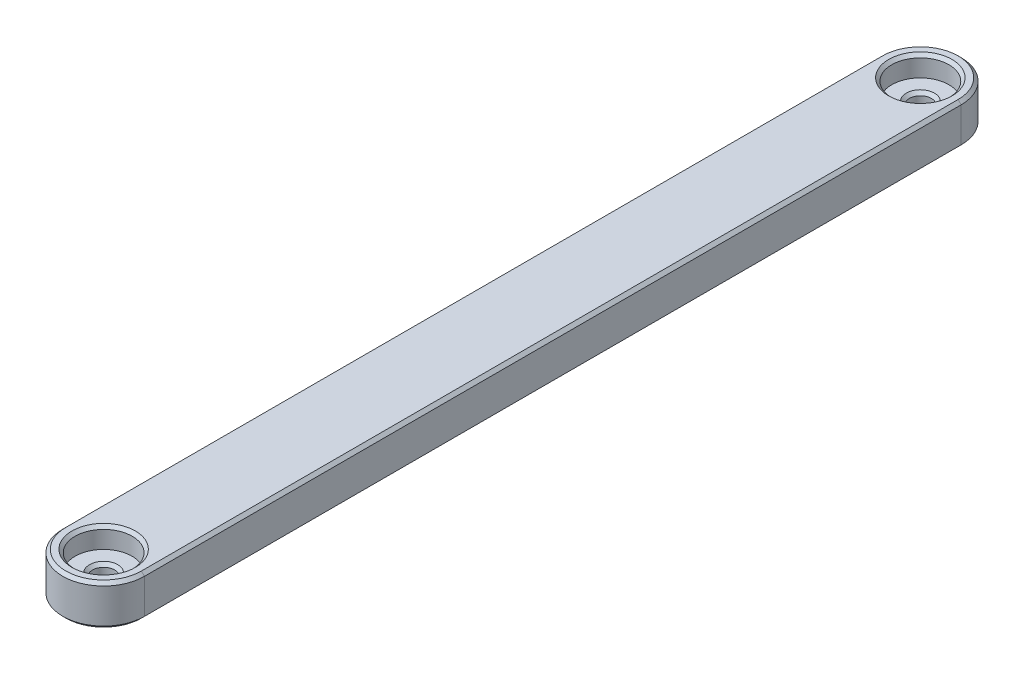
ISO-10303-21;
HEADER;
FILE_DESCRIPTION(('STEP AP214'),'2;1');
FILE_NAME('part.step','',(''),(''),'','','');
FILE_SCHEMA(('AUTOMOTIVE_DESIGN { 1 0 10303 214 1 1 1 1 }'));
ENDSEC;
DATA;
#1=APPLICATION_CONTEXT('core data for automotive mechanical design processes');
#2=APPLICATION_PROTOCOL_DEFINITION('international standard','automotive_design',2000,#1);
#3=PRODUCT_CONTEXT('',#1,'mechanical');
#4=PRODUCT('Part','Part','',(#3));
#5=PRODUCT_RELATED_PRODUCT_CATEGORY('part','',(#4));
#6=PRODUCT_DEFINITION_FORMATION('','',#4);
#7=PRODUCT_DEFINITION_CONTEXT('part definition',#1,'design');
#8=PRODUCT_DEFINITION('design','',#6,#7);
#9=PRODUCT_DEFINITION_SHAPE('','',#8);
#10=(LENGTH_UNIT() NAMED_UNIT(*) SI_UNIT(.MILLI.,.METRE.));
#11=(NAMED_UNIT(*) PLANE_ANGLE_UNIT() SI_UNIT($,.RADIAN.));
#12=(NAMED_UNIT(*) SI_UNIT($,.STERADIAN.) SOLID_ANGLE_UNIT());
#13=UNCERTAINTY_MEASURE_WITH_UNIT(LENGTH_MEASURE(1.E-05),#10,'distance_accuracy_value','');
#14=(GEOMETRIC_REPRESENTATION_CONTEXT(3) GLOBAL_UNCERTAINTY_ASSIGNED_CONTEXT((#13)) GLOBAL_UNIT_ASSIGNED_CONTEXT((#10,
#11,#12)) REPRESENTATION_CONTEXT('',''));
#15=CARTESIAN_POINT('',(0.,0.,0.));
#16=DIRECTION('',(0.,0.,1.));
#17=DIRECTION('',(1.,0.,0.));
#18=AXIS2_PLACEMENT_3D('',#15,#16,#17);
#19=CARTESIAN_POINT('',(0.,10.,100.));
#20=DIRECTION('',(0.,-1.,0.));
#21=DIRECTION('',(0.,0.,-1.));
#22=AXIS2_PLACEMENT_3D('',#19,#20,#21);
#23=CYLINDRICAL_SURFACE('',#22,2.7);
#24=CARTESIAN_POINT('',(0.,4.25000000000004,100.));
#25=DIRECTION('',(0.,1.,0.));
#26=DIRECTION('',(0.,0.,1.));
#27=AXIS2_PLACEMENT_3D('',#24,#25,#26);
#28=CIRCLE('',#27,2.7);
#29=CARTESIAN_POINT('',(0.,4.25000000000004,102.7));
#30=VERTEX_POINT('',#29);
#31=EDGE_CURVE('E199',#30,#30,#28,.T.);
#32=ORIENTED_EDGE('',*,*,#31,.T.);
#33=EDGE_LOOP('',(#32));
#34=FACE_BOUND('',#33,.T.);
#35=CARTESIAN_POINT('',(0.,0.75000000000002,100.));
#36=DIRECTION('',(0.,1.,0.));
#37=DIRECTION('',(0.,0.,1.));
#38=AXIS2_PLACEMENT_3D('',#35,#36,#37);
#39=CIRCLE('',#38,2.7);
#40=CARTESIAN_POINT('',(0.,0.75000000000002,102.7));
#41=VERTEX_POINT('',#40);
#42=EDGE_CURVE('E202',#41,#41,#39,.F.);
#43=ORIENTED_EDGE('',*,*,#42,.T.);
#44=EDGE_LOOP('',(#43));
#45=FACE_BOUND('',#44,.T.);
#46=ADVANCED_FACE('F37',(#34,#45),#23,.F.);
#47=CARTESIAN_POINT('',(0.,10.,-99.9999999999997));
#48=DIRECTION('',(0.,-1.,0.));
#49=DIRECTION('',(0.,0.,-1.));
#50=AXIS2_PLACEMENT_3D('',#47,#48,#49);
#51=CYLINDRICAL_SURFACE('',#50,2.7);
#52=CARTESIAN_POINT('',(0.,4.25000000000004,-99.9999999999997));
#53=DIRECTION('',(0.,1.,0.));
#54=DIRECTION('',(0.,0.,1.));
#55=AXIS2_PLACEMENT_3D('',#52,#53,#54);
#56=CIRCLE('',#55,2.7);
#57=CARTESIAN_POINT('',(0.,4.25000000000004,-97.2999999999997));
#58=VERTEX_POINT('',#57);
#59=EDGE_CURVE('E183',#58,#58,#56,.T.);
#60=ORIENTED_EDGE('',*,*,#59,.T.);
#61=EDGE_LOOP('',(#60));
#62=FACE_BOUND('',#61,.T.);
#63=CARTESIAN_POINT('',(0.,0.75000000000002,-99.9999999999997));
#64=DIRECTION('',(0.,1.,0.));
#65=DIRECTION('',(0.,0.,1.));
#66=AXIS2_PLACEMENT_3D('',#63,#64,#65);
#67=CIRCLE('',#66,2.7);
#68=CARTESIAN_POINT('',(0.,0.75000000000002,-97.2999999999997));
#69=VERTEX_POINT('',#68);
#70=EDGE_CURVE('E186',#69,#69,#67,.F.);
#71=ORIENTED_EDGE('',*,*,#70,.T.);
#72=EDGE_LOOP('',(#71));
#73=FACE_BOUND('',#72,.T.);
#74=ADVANCED_FACE('F239',(#62,#73),#51,.F.);
#75=CARTESIAN_POINT('',(0.,10.,100.));
#76=DIRECTION('',(0.,-1.,0.));
#77=DIRECTION('',(0.,0.,-1.));
#78=AXIS2_PLACEMENT_3D('',#75,#76,#77);
#79=CYLINDRICAL_SURFACE('',#78,10.);
#80=DIRECTION('',(0.,-1.,0.));
#81=VECTOR('',#80,1.);
#82=CARTESIAN_POINT('',(10.0000000000001,10.,100.));
#83=LINE('',#82,#81);
#84=CARTESIAN_POINT('',(10.0000000000001,9.25000000000003,100.));
#85=VERTEX_POINT('',#84);
#86=CARTESIAN_POINT('',(10.0000000000001,0.749999999999973,100.));
#87=VERTEX_POINT('',#86);
#88=EDGE_CURVE('E205',#85,#87,#83,.T.);
#89=ORIENTED_EDGE('',*,*,#88,.F.);
#90=CARTESIAN_POINT('',(0.,9.25000000000003,100.));
#91=DIRECTION('',(0.,1.,0.));
#92=DIRECTION('',(0.,0.,1.));
#93=AXIS2_PLACEMENT_3D('',#90,#91,#92);
#94=CIRCLE('',#93,10.);
#95=CARTESIAN_POINT('',(-10.,9.25000000000003,100.));
#96=VERTEX_POINT('',#95);
#97=EDGE_CURVE('E156',#85,#96,#94,.F.);
#98=ORIENTED_EDGE('',*,*,#97,.T.);
#99=DIRECTION('',(0.,-1.,0.));
#100=VECTOR('',#99,1.);
#101=CARTESIAN_POINT('',(-10.,10.,100.));
#102=LINE('',#101,#100);
#103=CARTESIAN_POINT('',(-10.,0.749999999999973,100.));
#104=VERTEX_POINT('',#103);
#105=EDGE_CURVE('E212',#96,#104,#102,.T.);
#106=ORIENTED_EDGE('',*,*,#105,.T.);
#107=CARTESIAN_POINT('',(0.,0.749999999999973,100.));
#108=DIRECTION('',(0.,1.,0.));
#109=DIRECTION('',(0.,0.,1.));
#110=AXIS2_PLACEMENT_3D('',#107,#108,#109);
#111=CIRCLE('',#110,10.);
#112=EDGE_CURVE('E130',#104,#87,#111,.T.);
#113=ORIENTED_EDGE('',*,*,#112,.T.);
#114=EDGE_LOOP('',(#89,#98,#106,#113));
#115=FACE_BOUND('',#114,.T.);
#116=ADVANCED_FACE('F245',(#115),#79,.T.);
#117=CARTESIAN_POINT('',(10.,10.,0.));
#118=DIRECTION('',(-1.,0.,0.));
#119=DIRECTION('',(0.,0.,1.));
#120=AXIS2_PLACEMENT_3D('',#117,#118,#119);
#121=PLANE('',#120);
#122=DIRECTION('',(0.,-1.,0.));
#123=VECTOR('',#122,1.);
#124=CARTESIAN_POINT('',(10.,10.,-99.9999999999997));
#125=LINE('',#124,#123);
#126=CARTESIAN_POINT('',(10.,9.25000000000003,-99.9999999999997));
#127=VERTEX_POINT('',#126);
#128=CARTESIAN_POINT('',(10.,0.749999999999973,-99.9999999999997));
#129=VERTEX_POINT('',#128);
#130=EDGE_CURVE('E208',#127,#129,#125,.T.);
#131=ORIENTED_EDGE('',*,*,#130,.F.);
#132=DIRECTION('',(0.,0.,1.));
#133=VECTOR('',#132,1.);
#134=CARTESIAN_POINT('',(10.0000000000001,9.25000000000003,100.));
#135=LINE('',#134,#133);
#136=EDGE_CURVE('E159',#127,#85,#135,.T.);
#137=ORIENTED_EDGE('',*,*,#136,.T.);
#138=ORIENTED_EDGE('',*,*,#88,.T.);
#139=DIRECTION('',(0.,0.,-1.));
#140=VECTOR('',#139,1.);
#141=CARTESIAN_POINT('',(10.,0.749999999999973,0.));
#142=LINE('',#141,#140);
#143=EDGE_CURVE('E162',#87,#129,#142,.T.);
#144=ORIENTED_EDGE('',*,*,#143,.T.);
#145=EDGE_LOOP('',(#131,#137,#138,#144));
#146=FACE_BOUND('',#145,.T.);
#147=ADVANCED_FACE('F368',(#146),#121,.F.);
#148=CARTESIAN_POINT('',(0.,10.,-99.9999999999997));
#149=DIRECTION('',(0.,-1.,0.));
#150=DIRECTION('',(0.,0.,-1.));
#151=AXIS2_PLACEMENT_3D('',#148,#149,#150);
#152=CYLINDRICAL_SURFACE('',#151,10.);
#153=DIRECTION('',(0.,-1.,0.));
#154=VECTOR('',#153,1.);
#155=CARTESIAN_POINT('',(-10.,10.,-99.9999999999997));
#156=LINE('',#155,#154);
#157=CARTESIAN_POINT('',(-10.,9.25000000000003,-99.9999999999997));
#158=VERTEX_POINT('',#157);
#159=CARTESIAN_POINT('',(-10.,0.749999999999973,-99.9999999999997));
#160=VERTEX_POINT('',#159);
#161=EDGE_CURVE('E210',#158,#160,#156,.T.);
#162=ORIENTED_EDGE('',*,*,#161,.F.);
#163=CARTESIAN_POINT('',(0.,9.25000000000003,-99.9999999999997));
#164=DIRECTION('',(0.,1.,0.));
#165=DIRECTION('',(0.,0.,1.));
#166=AXIS2_PLACEMENT_3D('',#163,#164,#165);
#167=CIRCLE('',#166,10.);
#168=EDGE_CURVE('E153',#158,#127,#167,.F.);
#169=ORIENTED_EDGE('',*,*,#168,.T.);
#170=ORIENTED_EDGE('',*,*,#130,.T.);
#171=CARTESIAN_POINT('',(0.,0.749999999999973,-99.9999999999997));
#172=DIRECTION('',(0.,1.,0.));
#173=DIRECTION('',(0.,0.,1.));
#174=AXIS2_PLACEMENT_3D('',#171,#172,#173);
#175=CIRCLE('',#174,10.);
#176=EDGE_CURVE('E55',#129,#160,#175,.T.);
#177=ORIENTED_EDGE('',*,*,#176,.T.);
#178=EDGE_LOOP('',(#162,#169,#170,#177));
#179=FACE_BOUND('',#178,.T.);
#180=ADVANCED_FACE('F366',(#179),#152,.T.);
#181=CARTESIAN_POINT('',(-10.,10.,0.));
#182=DIRECTION('',(-1.,0.,0.));
#183=DIRECTION('',(0.,0.,1.));
#184=AXIS2_PLACEMENT_3D('',#181,#182,#183);
#185=PLANE('',#184);
#186=ORIENTED_EDGE('',*,*,#105,.F.);
#187=DIRECTION('',(0.,0.,-1.));
#188=VECTOR('',#187,1.);
#189=CARTESIAN_POINT('',(-10.,9.25000000000003,0.));
#190=LINE('',#189,#188);
#191=EDGE_CURVE('E62',#96,#158,#190,.T.);
#192=ORIENTED_EDGE('',*,*,#191,.T.);
#193=ORIENTED_EDGE('',*,*,#161,.T.);
#194=DIRECTION('',(0.,0.,1.));
#195=VECTOR('',#194,1.);
#196=CARTESIAN_POINT('',(-10.,0.749999999999973,100.));
#197=LINE('',#196,#195);
#198=EDGE_CURVE('E151',#160,#104,#197,.T.);
#199=ORIENTED_EDGE('',*,*,#198,.T.);
#200=EDGE_LOOP('',(#186,#192,#193,#199));
#201=FACE_BOUND('',#200,.T.);
#202=ADVANCED_FACE('F346',(#201),#185,.T.);
#203=CARTESIAN_POINT('',(0.,10.,0.));
#204=DIRECTION('',(0.,1.,0.));
#205=DIRECTION('',(0.,0.,1.));
#206=AXIS2_PLACEMENT_3D('',#203,#204,#205);
#207=PLANE('',#206);
#208=CARTESIAN_POINT('',(0.,10.,100.));
#209=DIRECTION('',(0.,1.,0.));
#210=DIRECTION('',(0.,0.,1.));
#211=AXIS2_PLACEMENT_3D('',#208,#209,#210);
#212=CIRCLE('',#211,9.25000000000007);
#213=CARTESIAN_POINT('',(-9.25000000000003,10.,100.));
#214=VERTEX_POINT('',#213);
#215=CARTESIAN_POINT('',(9.2500000000001,10.,100.));
#216=VERTEX_POINT('',#215);
#217=EDGE_CURVE('E168',#214,#216,#212,.T.);
#218=ORIENTED_EDGE('',*,*,#217,.T.);
#219=DIRECTION('',(0.,0.,-1.));
#220=VECTOR('',#219,1.);
#221=CARTESIAN_POINT('',(9.25000000000002,10.,-99.9999999999997));
#222=LINE('',#221,#220);
#223=CARTESIAN_POINT('',(9.25000000000002,10.,-99.9999999999997));
#224=VERTEX_POINT('',#223);
#225=EDGE_CURVE('E165',#216,#224,#222,.T.);
#226=ORIENTED_EDGE('',*,*,#225,.T.);
#227=CARTESIAN_POINT('',(0.,10.,-99.9999999999997));
#228=DIRECTION('',(0.,1.,0.));
#229=DIRECTION('',(0.,0.,1.));
#230=AXIS2_PLACEMENT_3D('',#227,#228,#229);
#231=CIRCLE('',#230,9.25000000000003);
#232=CARTESIAN_POINT('',(-9.25000000000003,10.,-99.9999999999997));
#233=VERTEX_POINT('',#232);
#234=EDGE_CURVE('E170',#224,#233,#231,.T.);
#235=ORIENTED_EDGE('',*,*,#234,.T.);
#236=DIRECTION('',(0.,0.,1.));
#237=VECTOR('',#236,1.);
#238=CARTESIAN_POINT('',(-9.25000000000003,10.,0.));
#239=LINE('',#238,#237);
#240=EDGE_CURVE('E172',#233,#214,#239,.T.);
#241=ORIENTED_EDGE('',*,*,#240,.T.);
#242=EDGE_LOOP('',(#218,#226,#235,#241));
#243=FACE_BOUND('',#242,.T.);
#244=CARTESIAN_POINT('',(0.,10.,-99.9999999999997));
#245=DIRECTION('',(0.,1.,0.));
#246=DIRECTION('',(0.,0.,1.));
#247=AXIS2_PLACEMENT_3D('',#244,#245,#246);
#248=CIRCLE('',#247,7.74999999999995);
#249=CARTESIAN_POINT('',(0.,10.,-92.2499999999997));
#250=VERTEX_POINT('',#249);
#251=EDGE_CURVE('E174',#250,#250,#248,.F.);
#252=ORIENTED_EDGE('',*,*,#251,.T.);
#253=EDGE_LOOP('',(#252));
#254=FACE_BOUND('',#253,.T.);
#255=CARTESIAN_POINT('',(0.,10.,100.));
#256=DIRECTION('',(0.,1.,0.));
#257=DIRECTION('',(0.,0.,1.));
#258=AXIS2_PLACEMENT_3D('',#255,#256,#257);
#259=CIRCLE('',#258,7.74999999999998);
#260=CARTESIAN_POINT('',(0.,10.,107.75));
#261=VERTEX_POINT('',#260);
#262=EDGE_CURVE('E177',#261,#261,#259,.F.);
#263=ORIENTED_EDGE('',*,*,#262,.T.);
#264=EDGE_LOOP('',(#263));
#265=FACE_BOUND('',#264,.T.);
#266=ADVANCED_FACE('F343',(#243,#254,#265),#207,.T.);
#267=CARTESIAN_POINT('',(0.,0.,0.));
#268=DIRECTION('',(0.,1.,0.));
#269=DIRECTION('',(0.,0.,1.));
#270=AXIS2_PLACEMENT_3D('',#267,#268,#269);
#271=PLANE('',#270);
#272=CARTESIAN_POINT('',(0.,0.,100.));
#273=DIRECTION('',(0.,1.,0.));
#274=DIRECTION('',(0.,0.,1.));
#275=AXIS2_PLACEMENT_3D('',#272,#273,#274);
#276=CIRCLE('',#275,3.45000000000001);
#277=CARTESIAN_POINT('',(0.,0.,103.45));
#278=VERTEX_POINT('',#277);
#279=EDGE_CURVE('E189',#278,#278,#276,.T.);
#280=ORIENTED_EDGE('',*,*,#279,.T.);
#281=EDGE_LOOP('',(#280));
#282=FACE_BOUND('',#281,.T.);
#283=CARTESIAN_POINT('',(0.,0.,-99.9999999999997));
#284=DIRECTION('',(0.,1.,0.));
#285=DIRECTION('',(0.,0.,1.));
#286=AXIS2_PLACEMENT_3D('',#283,#284,#285);
#287=CIRCLE('',#286,3.45000000000001);
#288=CARTESIAN_POINT('',(0.,0.,-96.5499999999997));
#289=VERTEX_POINT('',#288);
#290=EDGE_CURVE('E192',#289,#289,#287,.T.);
#291=ORIENTED_EDGE('',*,*,#290,.T.);
#292=EDGE_LOOP('',(#291));
#293=FACE_BOUND('',#292,.T.);
#294=CARTESIAN_POINT('',(0.,0.,-99.9999999999997));
#295=DIRECTION('',(0.,1.,0.));
#296=DIRECTION('',(0.,0.,1.));
#297=AXIS2_PLACEMENT_3D('',#294,#295,#296);
#298=CIRCLE('',#297,9.25000000000003);
#299=CARTESIAN_POINT('',(-9.25000000000003,0.,-99.9999999999997));
#300=VERTEX_POINT('',#299);
#301=CARTESIAN_POINT('',(9.25000000000002,0.,-99.9999999999997));
#302=VERTEX_POINT('',#301);
#303=EDGE_CURVE('E117',#300,#302,#298,.F.);
#304=ORIENTED_EDGE('',*,*,#303,.T.);
#305=DIRECTION('',(0.,0.,1.));
#306=VECTOR('',#305,1.);
#307=CARTESIAN_POINT('',(9.25000000000006,0.,0.));
#308=LINE('',#307,#306);
#309=CARTESIAN_POINT('',(9.2500000000001,0.,100.));
#310=VERTEX_POINT('',#309);
#311=EDGE_CURVE('E113',#302,#310,#308,.T.);
#312=ORIENTED_EDGE('',*,*,#311,.T.);
#313=CARTESIAN_POINT('',(0.,0.,100.));
#314=DIRECTION('',(0.,1.,0.));
#315=DIRECTION('',(0.,0.,1.));
#316=AXIS2_PLACEMENT_3D('',#313,#314,#315);
#317=CIRCLE('',#316,9.25000000000007);
#318=CARTESIAN_POINT('',(-9.25000000000003,0.,100.));
#319=VERTEX_POINT('',#318);
#320=EDGE_CURVE('E107',#310,#319,#317,.F.);
#321=ORIENTED_EDGE('',*,*,#320,.T.);
#322=DIRECTION('',(0.,0.,-1.));
#323=VECTOR('',#322,1.);
#324=CARTESIAN_POINT('',(-9.25000000000003,0.,-99.9999999999997));
#325=LINE('',#324,#323);
#326=EDGE_CURVE('E110',#319,#300,#325,.T.);
#327=ORIENTED_EDGE('',*,*,#326,.T.);
#328=EDGE_LOOP('',(#304,#312,#321,#327));
#329=FACE_BOUND('',#328,.T.);
#330=ADVANCED_FACE('F109',(#282,#293,#329),#271,.F.);
#331=CARTESIAN_POINT('',(0.,5.,100.));
#332=DIRECTION('',(0.,1.,0.));
#333=DIRECTION('',(0.,0.,1.));
#334=AXIS2_PLACEMENT_3D('',#331,#332,#333);
#335=CYLINDRICAL_SURFACE('',#334,7.);
#336=CARTESIAN_POINT('',(0.,9.25000000000001,100.));
#337=DIRECTION('',(0.,1.,0.));
#338=DIRECTION('',(0.,0.,1.));
#339=AXIS2_PLACEMENT_3D('',#336,#337,#338);
#340=CIRCLE('',#339,7.);
#341=CARTESIAN_POINT('',(0.,9.25000000000001,107.));
#342=VERTEX_POINT('',#341);
#343=EDGE_CURVE('E11',#342,#342,#340,.T.);
#344=ORIENTED_EDGE('',*,*,#343,.T.);
#345=EDGE_LOOP('',(#344));
#346=FACE_BOUND('',#345,.T.);
#347=CARTESIAN_POINT('',(0.,5.,100.));
#348=DIRECTION('',(0.,1.,0.));
#349=DIRECTION('',(0.,0.,1.));
#350=AXIS2_PLACEMENT_3D('',#347,#348,#349);
#351=CIRCLE('',#350,7.);
#352=CARTESIAN_POINT('',(0.,5.,107.));
#353=VERTEX_POINT('',#352);
#354=EDGE_CURVE('E143',#353,#353,#351,.T.);
#355=ORIENTED_EDGE('',*,*,#354,.F.);
#356=EDGE_LOOP('',(#355));
#357=FACE_BOUND('',#356,.T.);
#358=ADVANCED_FACE('F235',(#346,#357),#335,.F.);
#359=CARTESIAN_POINT('',(0.,5.,100.));
#360=DIRECTION('',(0.,1.,0.));
#361=DIRECTION('',(0.,0.,1.));
#362=AXIS2_PLACEMENT_3D('',#359,#360,#361);
#363=PLANE('',#362);
#364=CARTESIAN_POINT('',(0.,5.,100.));
#365=DIRECTION('',(0.,1.,0.));
#366=DIRECTION('',(0.,0.,1.));
#367=AXIS2_PLACEMENT_3D('',#364,#365,#366);
#368=CIRCLE('',#367,3.44999999999998);
#369=CARTESIAN_POINT('',(0.,5.,103.45));
#370=VERTEX_POINT('',#369);
#371=EDGE_CURVE('E127',#370,#370,#368,.F.);
#372=ORIENTED_EDGE('',*,*,#371,.T.);
#373=EDGE_LOOP('',(#372));
#374=FACE_BOUND('',#373,.T.);
#375=ORIENTED_EDGE('',*,*,#354,.T.);
#376=EDGE_LOOP('',(#375));
#377=FACE_BOUND('',#376,.T.);
#378=ADVANCED_FACE('F225',(#374,#377),#363,.T.);
#379=CARTESIAN_POINT('',(0.,5.,-99.9999999999997));
#380=DIRECTION('',(0.,1.,0.));
#381=DIRECTION('',(0.,0.,1.));
#382=AXIS2_PLACEMENT_3D('',#379,#380,#381);
#383=CYLINDRICAL_SURFACE('',#382,7.);
#384=CARTESIAN_POINT('',(0.,9.25000000000007,-99.9999999999997));
#385=DIRECTION('',(0.,1.,0.));
#386=DIRECTION('',(0.,0.,1.));
#387=AXIS2_PLACEMENT_3D('',#384,#385,#386);
#388=CIRCLE('',#387,7.);
#389=CARTESIAN_POINT('',(0.,9.25000000000007,-92.9999999999997));
#390=VERTEX_POINT('',#389);
#391=EDGE_CURVE('E47',#390,#390,#388,.T.);
#392=ORIENTED_EDGE('',*,*,#391,.T.);
#393=EDGE_LOOP('',(#392));
#394=FACE_BOUND('',#393,.T.);
#395=CARTESIAN_POINT('',(0.,5.,-99.9999999999997));
#396=DIRECTION('',(0.,1.,0.));
#397=DIRECTION('',(0.,0.,1.));
#398=AXIS2_PLACEMENT_3D('',#395,#396,#397);
#399=CIRCLE('',#398,7.);
#400=CARTESIAN_POINT('',(0.,5.,-92.9999999999997));
#401=VERTEX_POINT('',#400);
#402=EDGE_CURVE('E215',#401,#401,#399,.T.);
#403=ORIENTED_EDGE('',*,*,#402,.F.);
#404=EDGE_LOOP('',(#403));
#405=FACE_BOUND('',#404,.T.);
#406=ADVANCED_FACE('F223',(#394,#405),#383,.F.);
#407=CARTESIAN_POINT('',(0.,5.,-99.9999999999997));
#408=DIRECTION('',(0.,1.,0.));
#409=DIRECTION('',(0.,0.,1.));
#410=AXIS2_PLACEMENT_3D('',#407,#408,#409);
#411=PLANE('',#410);
#412=CARTESIAN_POINT('',(0.,5.,-99.9999999999997));
#413=DIRECTION('',(0.,1.,0.));
#414=DIRECTION('',(0.,0.,1.));
#415=AXIS2_PLACEMENT_3D('',#412,#413,#414);
#416=CIRCLE('',#415,3.44999999999998);
#417=CARTESIAN_POINT('',(0.,5.,-96.5499999999997));
#418=VERTEX_POINT('',#417);
#419=EDGE_CURVE('E180',#418,#418,#416,.F.);
#420=ORIENTED_EDGE('',*,*,#419,.T.);
#421=EDGE_LOOP('',(#420));
#422=FACE_BOUND('',#421,.T.);
#423=ORIENTED_EDGE('',*,*,#402,.T.);
#424=EDGE_LOOP('',(#423));
#425=FACE_BOUND('',#424,.T.);
#426=ADVANCED_FACE('F221',(#422,#425),#411,.T.);
#427=CARTESIAN_POINT('',(0.,4.25000000000004,100.));
#428=DIRECTION('',(0.,1.,0.));
#429=DIRECTION('',(0.,0.,1.));
#430=AXIS2_PLACEMENT_3D('',#427,#428,#429);
#431=CONICAL_SURFACE('',#430,2.7,0.78539816339746);
#432=ORIENTED_EDGE('',*,*,#371,.F.);
#433=EDGE_LOOP('',(#432));
#434=FACE_BOUND('',#433,.T.);
#435=ORIENTED_EDGE('',*,*,#31,.F.);
#436=EDGE_LOOP('',(#435));
#437=FACE_BOUND('',#436,.T.);
#438=ADVANCED_FACE('F232',(#434,#437),#431,.F.);
#439=CARTESIAN_POINT('',(0.,0.,100.));
#440=DIRECTION('',(0.,-1.,0.));
#441=DIRECTION('',(0.,0.,-1.));
#442=AXIS2_PLACEMENT_3D('',#439,#440,#441);
#443=CONICAL_SURFACE('',#442,3.45000000000001,0.785398163397442);
#444=ORIENTED_EDGE('',*,*,#42,.F.);
#445=EDGE_LOOP('',(#444));
#446=FACE_BOUND('',#445,.T.);
#447=ORIENTED_EDGE('',*,*,#279,.F.);
#448=EDGE_LOOP('',(#447));
#449=FACE_BOUND('',#448,.T.);
#450=ADVANCED_FACE('F258',(#446,#449),#443,.F.);
#451=CARTESIAN_POINT('',(0.,4.25000000000004,-99.9999999999997));
#452=DIRECTION('',(0.,1.,0.));
#453=DIRECTION('',(0.,0.,1.));
#454=AXIS2_PLACEMENT_3D('',#451,#452,#453);
#455=CONICAL_SURFACE('',#454,2.7,0.78539816339746);
#456=ORIENTED_EDGE('',*,*,#419,.F.);
#457=EDGE_LOOP('',(#456));
#458=FACE_BOUND('',#457,.T.);
#459=ORIENTED_EDGE('',*,*,#59,.F.);
#460=EDGE_LOOP('',(#459));
#461=FACE_BOUND('',#460,.T.);
#462=ADVANCED_FACE('F265',(#458,#461),#455,.F.);
#463=CARTESIAN_POINT('',(0.,0.,-99.9999999999997));
#464=DIRECTION('',(0.,-1.,0.));
#465=DIRECTION('',(0.,0.,-1.));
#466=AXIS2_PLACEMENT_3D('',#463,#464,#465);
#467=CONICAL_SURFACE('',#466,3.45000000000001,0.785398163397442);
#468=ORIENTED_EDGE('',*,*,#70,.F.);
#469=EDGE_LOOP('',(#468));
#470=FACE_BOUND('',#469,.T.);
#471=ORIENTED_EDGE('',*,*,#290,.F.);
#472=EDGE_LOOP('',(#471));
#473=FACE_BOUND('',#472,.T.);
#474=ADVANCED_FACE('F272',(#470,#473),#467,.F.);
#475=CARTESIAN_POINT('',(-10.,9.25000000000003,0.));
#476=DIRECTION('',(0.707106781186547,-0.707106781186547,0.));
#477=DIRECTION('',(0.,0.,-1.));
#478=AXIS2_PLACEMENT_3D('',#475,#476,#477);
#479=PLANE('',#478);
#480=DIRECTION('',(0.707106781186547,0.707106781186547,0.));
#481=VECTOR('',#480,1.);
#482=CARTESIAN_POINT('',(-10.,9.25000000000003,-99.9999999999997));
#483=LINE('',#482,#481);
#484=EDGE_CURVE('E144',#158,#233,#483,.T.);
#485=ORIENTED_EDGE('',*,*,#484,.F.);
#486=ORIENTED_EDGE('',*,*,#191,.F.);
#487=DIRECTION('',(-0.707106781186547,-0.707106781186547,0.));
#488=VECTOR('',#487,1.);
#489=CARTESIAN_POINT('',(-9.25000000000003,10.,100.));
#490=LINE('',#489,#488);
#491=EDGE_CURVE('E140',#214,#96,#490,.T.);
#492=ORIENTED_EDGE('',*,*,#491,.F.);
#493=ORIENTED_EDGE('',*,*,#240,.F.);
#494=EDGE_LOOP('',(#485,#486,#492,#493));
#495=FACE_BOUND('',#494,.T.);
#496=ADVANCED_FACE('F279',(#495),#479,.F.);
#497=CARTESIAN_POINT('',(0.,9.25000000000003,100.));
#498=DIRECTION('',(0.,-1.,0.));
#499=DIRECTION('',(0.,0.,-1.));
#500=AXIS2_PLACEMENT_3D('',#497,#498,#499);
#501=CONICAL_SURFACE('',#500,10.,0.785398163397448);
#502=ORIENTED_EDGE('',*,*,#491,.T.);
#503=ORIENTED_EDGE('',*,*,#97,.F.);
#504=DIRECTION('',(0.707106781186547,-0.707106781186547,0.));
#505=VECTOR('',#504,1.);
#506=CARTESIAN_POINT('',(9.2500000000001,10.,100.));
#507=LINE('',#506,#505);
#508=EDGE_CURVE('E132',#216,#85,#507,.T.);
#509=ORIENTED_EDGE('',*,*,#508,.F.);
#510=ORIENTED_EDGE('',*,*,#217,.F.);
#511=EDGE_LOOP('',(#502,#503,#509,#510));
#512=FACE_BOUND('',#511,.T.);
#513=ADVANCED_FACE('F296',(#512),#501,.T.);
#514=CARTESIAN_POINT('',(0.,9.25000000000003,-99.9999999999997));
#515=DIRECTION('',(0.,-1.,0.));
#516=DIRECTION('',(0.,0.,-1.));
#517=AXIS2_PLACEMENT_3D('',#514,#515,#516);
#518=CONICAL_SURFACE('',#517,10.,0.785398163397448);
#519=ORIENTED_EDGE('',*,*,#484,.T.);
#520=ORIENTED_EDGE('',*,*,#234,.F.);
#521=DIRECTION('',(-0.707106781186547,0.707106781186547,0.));
#522=VECTOR('',#521,1.);
#523=CARTESIAN_POINT('',(10.,9.25000000000003,-99.9999999999997));
#524=LINE('',#523,#522);
#525=EDGE_CURVE('E131',#127,#224,#524,.T.);
#526=ORIENTED_EDGE('',*,*,#525,.F.);
#527=ORIENTED_EDGE('',*,*,#168,.F.);
#528=EDGE_LOOP('',(#519,#520,#526,#527));
#529=FACE_BOUND('',#528,.T.);
#530=ADVANCED_FACE('F289',(#529),#518,.T.);
#531=CARTESIAN_POINT('',(9.25000000000006,10.,0.));
#532=DIRECTION('',(0.707106781186547,0.707106781186547,0.));
#533=DIRECTION('',(0.,0.,1.));
#534=AXIS2_PLACEMENT_3D('',#531,#532,#533);
#535=PLANE('',#534);
#536=ORIENTED_EDGE('',*,*,#508,.T.);
#537=ORIENTED_EDGE('',*,*,#136,.F.);
#538=ORIENTED_EDGE('',*,*,#525,.T.);
#539=ORIENTED_EDGE('',*,*,#225,.F.);
#540=EDGE_LOOP('',(#536,#537,#538,#539));
#541=FACE_BOUND('',#540,.T.);
#542=ADVANCED_FACE('F282',(#541),#535,.T.);
#543=CARTESIAN_POINT('',(-9.25000000000003,0.,0.));
#544=DIRECTION('',(-0.707106781186547,-0.707106781186547,0.));
#545=DIRECTION('',(0.,0.,1.));
#546=AXIS2_PLACEMENT_3D('',#543,#544,#545);
#547=PLANE('',#546);
#548=DIRECTION('',(-0.707106781186547,0.707106781186547,0.));
#549=VECTOR('',#548,1.);
#550=CARTESIAN_POINT('',(-9.25000000000003,0.,-99.9999999999997));
#551=LINE('',#550,#549);
#552=EDGE_CURVE('E125',#300,#160,#551,.T.);
#553=ORIENTED_EDGE('',*,*,#552,.F.);
#554=ORIENTED_EDGE('',*,*,#326,.F.);
#555=DIRECTION('',(0.707106781186547,-0.707106781186547,0.));
#556=VECTOR('',#555,1.);
#557=CARTESIAN_POINT('',(-10.,0.749999999999973,100.));
#558=LINE('',#557,#556);
#559=EDGE_CURVE('E42',#104,#319,#558,.T.);
#560=ORIENTED_EDGE('',*,*,#559,.F.);
#561=ORIENTED_EDGE('',*,*,#198,.F.);
#562=EDGE_LOOP('',(#553,#554,#560,#561));
#563=FACE_BOUND('',#562,.T.);
#564=ADVANCED_FACE('F121',(#563),#547,.T.);
#565=CARTESIAN_POINT('',(0.,0.,100.));
#566=DIRECTION('',(0.,1.,0.));
#567=DIRECTION('',(0.,0.,1.));
#568=AXIS2_PLACEMENT_3D('',#565,#566,#567);
#569=CONICAL_SURFACE('',#568,9.25000000000007,0.785398163397448);
#570=ORIENTED_EDGE('',*,*,#559,.T.);
#571=ORIENTED_EDGE('',*,*,#320,.F.);
#572=DIRECTION('',(-0.707106781186547,-0.707106781186547,0.));
#573=VECTOR('',#572,1.);
#574=CARTESIAN_POINT('',(10.0000000000001,0.749999999999973,100.));
#575=LINE('',#574,#573);
#576=EDGE_CURVE('E134',#87,#310,#575,.T.);
#577=ORIENTED_EDGE('',*,*,#576,.F.);
#578=ORIENTED_EDGE('',*,*,#112,.F.);
#579=EDGE_LOOP('',(#570,#571,#577,#578));
#580=FACE_BOUND('',#579,.T.);
#581=ADVANCED_FACE('F129',(#580),#569,.T.);
#582=CARTESIAN_POINT('',(0.,0.,-99.9999999999997));
#583=DIRECTION('',(0.,1.,0.));
#584=DIRECTION('',(0.,0.,1.));
#585=AXIS2_PLACEMENT_3D('',#582,#583,#584);
#586=CONICAL_SURFACE('',#585,9.25000000000003,0.785398163397448);
#587=ORIENTED_EDGE('',*,*,#552,.T.);
#588=ORIENTED_EDGE('',*,*,#176,.F.);
#589=DIRECTION('',(0.707106781186547,0.707106781186547,0.));
#590=VECTOR('',#589,1.);
#591=CARTESIAN_POINT('',(9.25000000000002,0.,-99.9999999999997));
#592=LINE('',#591,#590);
#593=EDGE_CURVE('E136',#302,#129,#592,.T.);
#594=ORIENTED_EDGE('',*,*,#593,.F.);
#595=ORIENTED_EDGE('',*,*,#303,.F.);
#596=EDGE_LOOP('',(#587,#588,#594,#595));
#597=FACE_BOUND('',#596,.T.);
#598=ADVANCED_FACE('F317',(#597),#586,.T.);
#599=CARTESIAN_POINT('',(10.,0.749999999999973,0.));
#600=DIRECTION('',(-0.707106781186547,0.707106781186547,0.));
#601=DIRECTION('',(0.,0.,-1.));
#602=AXIS2_PLACEMENT_3D('',#599,#600,#601);
#603=PLANE('',#602);
#604=ORIENTED_EDGE('',*,*,#576,.T.);
#605=ORIENTED_EDGE('',*,*,#311,.F.);
#606=ORIENTED_EDGE('',*,*,#593,.T.);
#607=ORIENTED_EDGE('',*,*,#143,.F.);
#608=EDGE_LOOP('',(#604,#605,#606,#607));
#609=FACE_BOUND('',#608,.T.);
#610=ADVANCED_FACE('F309',(#609),#603,.F.);
#611=CARTESIAN_POINT('',(0.,9.25000000000007,-99.9999999999997));
#612=DIRECTION('',(0.,1.,0.));
#613=DIRECTION('',(0.,0.,1.));
#614=AXIS2_PLACEMENT_3D('',#611,#612,#613);
#615=CONICAL_SURFACE('',#614,7.,0.785398163397458);
#616=ORIENTED_EDGE('',*,*,#251,.F.);
#617=EDGE_LOOP('',(#616));
#618=FACE_BOUND('',#617,.T.);
#619=ORIENTED_EDGE('',*,*,#391,.F.);
#620=EDGE_LOOP('',(#619));
#621=FACE_BOUND('',#620,.T.);
#622=ADVANCED_FACE('F316',(#618,#621),#615,.F.);
#623=CARTESIAN_POINT('',(0.,9.25000000000001,100.));
#624=DIRECTION('',(0.,1.,0.));
#625=DIRECTION('',(0.,0.,1.));
#626=AXIS2_PLACEMENT_3D('',#623,#624,#625);
#627=CONICAL_SURFACE('',#626,7.,0.78539816339744);
#628=ORIENTED_EDGE('',*,*,#262,.F.);
#629=EDGE_LOOP('',(#628));
#630=FACE_BOUND('',#629,.T.);
#631=ORIENTED_EDGE('',*,*,#343,.F.);
#632=EDGE_LOOP('',(#631));
#633=FACE_BOUND('',#632,.T.);
#634=ADVANCED_FACE('F40',(#630,#633),#627,.F.);
#635=CLOSED_SHELL('',(#46,#74,#116,#147,#180,#202,#266,#330,#358,#378,#406,#426,#438,#450,#462,
#474,#496,#513,#530,#542,#564,#581,#598,#610,#622,#634));
#636=MANIFOLD_SOLID_BREP('B2',#635);
#637=ADVANCED_BREP_SHAPE_REPRESENTATION('',(#18,#636),#14);
#638=SHAPE_DEFINITION_REPRESENTATION(#9,#637);
ENDSEC;
END-ISO-10303-21;
